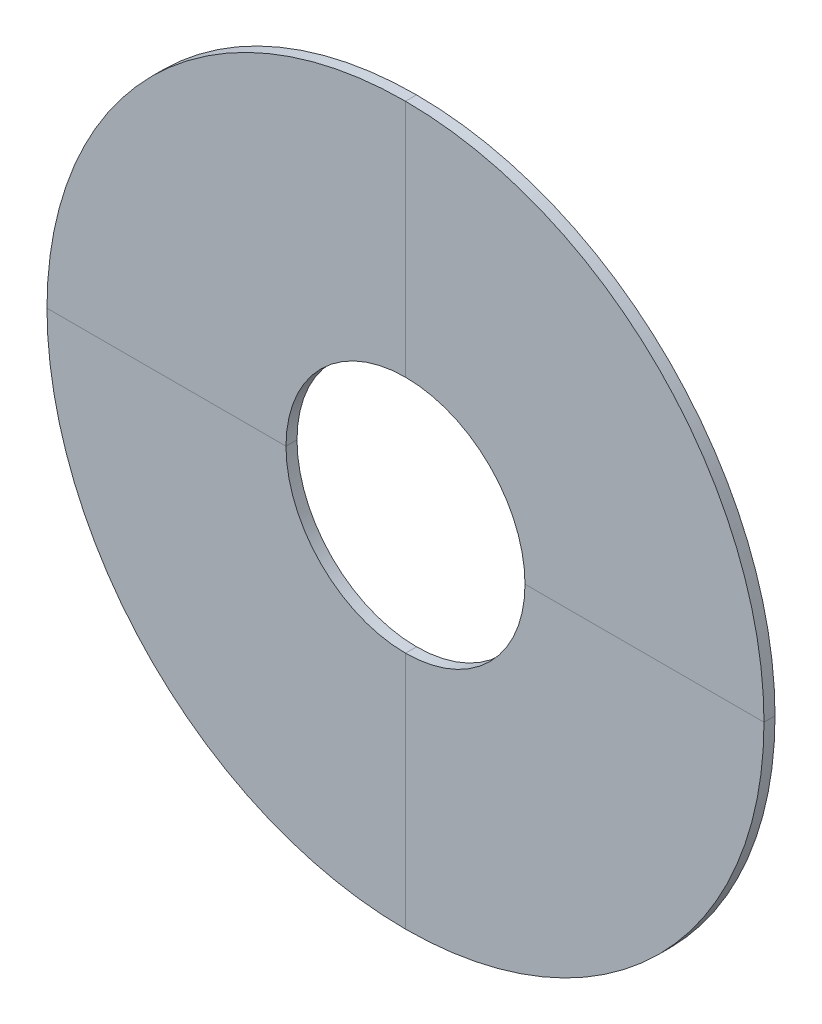
ISO-10303-21;
HEADER;
FILE_DESCRIPTION(('STEP AP214'),'2;1');
FILE_NAME('part.step','',(''),(''),'','','');
FILE_SCHEMA(('AUTOMOTIVE_DESIGN { 1 0 10303 214 1 1 1 1 }'));
ENDSEC;
DATA;
#1=APPLICATION_CONTEXT('core data for automotive mechanical design processes');
#2=APPLICATION_PROTOCOL_DEFINITION('international standard','automotive_design',2000,#1);
#3=PRODUCT_CONTEXT('',#1,'mechanical');
#4=PRODUCT('Part','Part','',(#3));
#5=PRODUCT_RELATED_PRODUCT_CATEGORY('part','',(#4));
#6=PRODUCT_DEFINITION_FORMATION('','',#4);
#7=PRODUCT_DEFINITION_CONTEXT('part definition',#1,'design');
#8=PRODUCT_DEFINITION('design','',#6,#7);
#9=PRODUCT_DEFINITION_SHAPE('','',#8);
#10=(LENGTH_UNIT() NAMED_UNIT(*) SI_UNIT(.MILLI.,.METRE.));
#11=(NAMED_UNIT(*) PLANE_ANGLE_UNIT() SI_UNIT($,.RADIAN.));
#12=(NAMED_UNIT(*) SI_UNIT($,.STERADIAN.) SOLID_ANGLE_UNIT());
#13=UNCERTAINTY_MEASURE_WITH_UNIT(LENGTH_MEASURE(1.E-05),#10,'distance_accuracy_value','');
#14=(GEOMETRIC_REPRESENTATION_CONTEXT(3) GLOBAL_UNCERTAINTY_ASSIGNED_CONTEXT((#13)) GLOBAL_UNIT_ASSIGNED_CONTEXT((#10,
#11,#12)) REPRESENTATION_CONTEXT('',''));
#15=CARTESIAN_POINT('',(0.,0.,0.));
#16=DIRECTION('',(0.,0.,1.));
#17=DIRECTION('',(1.,0.,0.));
#18=AXIS2_PLACEMENT_3D('',#15,#16,#17);
#19=CARTESIAN_POINT('',(0.,0.,0.));
#20=DIRECTION('',(0.,1.,0.));
#21=DIRECTION('',(0.,0.,1.));
#22=AXIS2_PLACEMENT_3D('',#19,#20,#21);
#23=PLANE('',#22);
#24=DIRECTION('',(1.,0.,0.));
#25=VECTOR('',#24,1.);
#26=CARTESIAN_POINT('',(0.,0.,2.99999999999998));
#27=LINE('',#26,#25);
#28=CARTESIAN_POINT('',(-195.,0.,2.99999999999998));
#29=VERTEX_POINT('',#28);
#30=CARTESIAN_POINT('',(-65.,0.,2.99999999999999));
#31=VERTEX_POINT('',#30);
#32=EDGE_CURVE('E105',#29,#31,#27,.T.);
#33=ORIENTED_EDGE('',*,*,#32,.T.);
#34=DIRECTION('',(0.,0.,1.));
#35=VECTOR('',#34,1.);
#36=CARTESIAN_POINT('',(-65.,0.,3.));
#37=LINE('',#36,#35);
#38=CARTESIAN_POINT('',(-65.,0.,-3.00000000000001));
#39=VERTEX_POINT('',#38);
#40=EDGE_CURVE('E109',#31,#39,#37,.F.);
#41=ORIENTED_EDGE('',*,*,#40,.T.);
#42=DIRECTION('',(-1.,0.,0.));
#43=VECTOR('',#42,1.);
#44=CARTESIAN_POINT('',(0.,0.,-3.00000000000003));
#45=LINE('',#44,#43);
#46=CARTESIAN_POINT('',(-195.,0.,-3.00000000000005));
#47=VERTEX_POINT('',#46);
#48=EDGE_CURVE('E95',#39,#47,#45,.T.);
#49=ORIENTED_EDGE('',*,*,#48,.T.);
#50=DIRECTION('',(0.,0.,1.));
#51=VECTOR('',#50,1.);
#52=CARTESIAN_POINT('',(-195.,0.,3.));
#53=LINE('',#52,#51);
#54=EDGE_CURVE('E99',#47,#29,#53,.T.);
#55=ORIENTED_EDGE('',*,*,#54,.T.);
#56=EDGE_LOOP('',(#33,#41,#49,#55));
#57=FACE_BOUND('',#56,.T.);
#58=ADVANCED_FACE('F53',(#57),#23,.T.);
#59=CARTESIAN_POINT('',(0.,0.,3.));
#60=DIRECTION('',(0.,0.,1.));
#61=DIRECTION('',(0.,-1.,0.));
#62=AXIS2_PLACEMENT_3D('',#59,#60,#61);
#63=CYLINDRICAL_SURFACE('',#62,65.);
#64=ORIENTED_EDGE('',*,*,#40,.F.);
#65=CARTESIAN_POINT('',(0.,0.,2.99999999999999));
#66=DIRECTION('',(0.,0.,1.));
#67=DIRECTION('',(0.,-1.,0.));
#68=AXIS2_PLACEMENT_3D('',#65,#66,#67);
#69=CIRCLE('',#68,65.);
#70=CARTESIAN_POINT('',(0.,-65.,2.99999999999998));
#71=VERTEX_POINT('',#70);
#72=EDGE_CURVE('E118',#31,#71,#69,.T.);
#73=ORIENTED_EDGE('',*,*,#72,.T.);
#74=DIRECTION('',(0.,0.,1.));
#75=VECTOR('',#74,1.);
#76=CARTESIAN_POINT('',(0.,-65.,2.99999999999999));
#77=LINE('',#76,#75);
#78=CARTESIAN_POINT('',(0.,-65.,-3.00000000000003));
#79=VERTEX_POINT('',#78);
#80=EDGE_CURVE('E119',#79,#71,#77,.T.);
#81=ORIENTED_EDGE('',*,*,#80,.F.);
#82=CARTESIAN_POINT('',(0.,0.,-3.00000000000001));
#83=DIRECTION('',(0.,0.,1.));
#84=DIRECTION('',(0.,-1.,0.));
#85=AXIS2_PLACEMENT_3D('',#82,#83,#84);
#86=CIRCLE('',#85,65.);
#87=EDGE_CURVE('E77',#39,#79,#86,.T.);
#88=ORIENTED_EDGE('',*,*,#87,.F.);
#89=EDGE_LOOP('',(#64,#73,#81,#88));
#90=FACE_BOUND('',#89,.T.);
#91=ADVANCED_FACE('F138',(#90),#63,.F.);
#92=CARTESIAN_POINT('',(0.,65.,3.));
#93=DIRECTION('',(0.,0.,-1.));
#94=DIRECTION('',(0.,1.,0.));
#95=AXIS2_PLACEMENT_3D('',#92,#93,#94);
#96=PLANE('',#95);
#97=ORIENTED_EDGE('',*,*,#32,.F.);
#98=CARTESIAN_POINT('',(0.,0.,2.99999999999998));
#99=DIRECTION('',(0.,0.,1.));
#100=DIRECTION('',(0.,-1.,0.));
#101=AXIS2_PLACEMENT_3D('',#98,#99,#100);
#102=CIRCLE('',#101,195.);
#103=CARTESIAN_POINT('',(0.,-195.,2.99999999999994));
#104=VERTEX_POINT('',#103);
#105=EDGE_CURVE('E96',#29,#104,#102,.T.);
#106=ORIENTED_EDGE('',*,*,#105,.T.);
#107=DIRECTION('',(0.,-1.,0.));
#108=VECTOR('',#107,1.);
#109=CARTESIAN_POINT('',(0.,65.,3.));
#110=LINE('',#109,#108);
#111=EDGE_CURVE('E120',#71,#104,#110,.T.);
#112=ORIENTED_EDGE('',*,*,#111,.F.);
#113=ORIENTED_EDGE('',*,*,#72,.F.);
#114=EDGE_LOOP('',(#97,#106,#112,#113));
#115=FACE_BOUND('',#114,.T.);
#116=ADVANCED_FACE('F136',(#115),#96,.F.);
#117=CARTESIAN_POINT('',(0.,0.,3.));
#118=DIRECTION('',(0.,0.,1.));
#119=DIRECTION('',(0.,-1.,0.));
#120=AXIS2_PLACEMENT_3D('',#117,#118,#119);
#121=CYLINDRICAL_SURFACE('',#120,195.);
#122=ORIENTED_EDGE('',*,*,#54,.F.);
#123=CARTESIAN_POINT('',(0.,0.,-3.00000000000005));
#124=DIRECTION('',(0.,0.,1.));
#125=DIRECTION('',(0.,-1.,0.));
#126=AXIS2_PLACEMENT_3D('',#123,#124,#125);
#127=CIRCLE('',#126,195.);
#128=CARTESIAN_POINT('',(0.,-195.,-3.00000000000009));
#129=VERTEX_POINT('',#128);
#130=EDGE_CURVE('E69',#47,#129,#127,.T.);
#131=ORIENTED_EDGE('',*,*,#130,.T.);
#132=DIRECTION('',(0.,0.,1.));
#133=VECTOR('',#132,1.);
#134=CARTESIAN_POINT('',(0.,-195.,2.99999999999996));
#135=LINE('',#134,#133);
#136=EDGE_CURVE('E62',#104,#129,#135,.F.);
#137=ORIENTED_EDGE('',*,*,#136,.F.);
#138=ORIENTED_EDGE('',*,*,#105,.F.);
#139=EDGE_LOOP('',(#122,#131,#137,#138));
#140=FACE_BOUND('',#139,.T.);
#141=ADVANCED_FACE('F100',(#140),#121,.T.);
#142=CARTESIAN_POINT('',(0.,195.,-3.));
#143=DIRECTION('',(0.,0.,1.));
#144=DIRECTION('',(0.,-1.,0.));
#145=AXIS2_PLACEMENT_3D('',#142,#143,#144);
#146=PLANE('',#145);
#147=ORIENTED_EDGE('',*,*,#48,.F.);
#148=ORIENTED_EDGE('',*,*,#87,.T.);
#149=DIRECTION('',(0.,1.,0.));
#150=VECTOR('',#149,1.);
#151=CARTESIAN_POINT('',(0.,195.,-3.));
#152=LINE('',#151,#150);
#153=EDGE_CURVE('E12',#129,#79,#152,.T.);
#154=ORIENTED_EDGE('',*,*,#153,.F.);
#155=ORIENTED_EDGE('',*,*,#130,.F.);
#156=EDGE_LOOP('',(#147,#148,#154,#155));
#157=FACE_BOUND('',#156,.T.);
#158=ADVANCED_FACE('F55',(#157),#146,.F.);
#159=CARTESIAN_POINT('',(0.,0.,0.));
#160=DIRECTION('',(1.,0.,0.));
#161=DIRECTION('',(0.,0.,-1.));
#162=AXIS2_PLACEMENT_3D('',#159,#160,#161);
#163=PLANE('',#162);
#164=ORIENTED_EDGE('',*,*,#153,.T.);
#165=ORIENTED_EDGE('',*,*,#80,.T.);
#166=ORIENTED_EDGE('',*,*,#111,.T.);
#167=ORIENTED_EDGE('',*,*,#136,.T.);
#168=EDGE_LOOP('',(#164,#165,#166,#167));
#169=FACE_BOUND('',#168,.T.);
#170=ADVANCED_FACE('F139',(#169),#163,.T.);
#171=CLOSED_SHELL('',(#58,#91,#116,#141,#158,#170));
#172=MANIFOLD_SOLID_BREP('B2',#171);
#173=CARTESIAN_POINT('',(0.,0.,0.));
#174=DIRECTION('',(0.,1.,0.));
#175=DIRECTION('',(0.,0.,1.));
#176=AXIS2_PLACEMENT_3D('',#173,#174,#175);
#177=PLANE('',#176);
#178=DIRECTION('',(1.,0.,0.));
#179=VECTOR('',#178,1.);
#180=CARTESIAN_POINT('',(0.,0.,2.99999999999998));
#181=LINE('',#180,#179);
#182=CARTESIAN_POINT('',(-195.,0.,2.99999999999998));
#183=VERTEX_POINT('',#182);
#184=CARTESIAN_POINT('',(-65.,0.,2.99999999999999));
#185=VERTEX_POINT('',#184);
#186=EDGE_CURVE('E219',#183,#185,#181,.T.);
#187=ORIENTED_EDGE('',*,*,#186,.F.);
#188=DIRECTION('',(0.,0.,1.));
#189=VECTOR('',#188,1.);
#190=CARTESIAN_POINT('',(-195.,0.,3.));
#191=LINE('',#190,#189);
#192=CARTESIAN_POINT('',(-195.,0.,-3.00000000000005));
#193=VERTEX_POINT('',#192);
#194=EDGE_CURVE('E232',#193,#183,#191,.T.);
#195=ORIENTED_EDGE('',*,*,#194,.F.);
#196=DIRECTION('',(-1.,0.,0.));
#197=VECTOR('',#196,1.);
#198=CARTESIAN_POINT('',(0.,0.,-3.00000000000003));
#199=LINE('',#198,#197);
#200=CARTESIAN_POINT('',(-65.,0.,-3.00000000000001));
#201=VERTEX_POINT('',#200);
#202=EDGE_CURVE('E256',#201,#193,#199,.T.);
#203=ORIENTED_EDGE('',*,*,#202,.F.);
#204=DIRECTION('',(0.,0.,1.));
#205=VECTOR('',#204,1.);
#206=CARTESIAN_POINT('',(-65.,0.,3.));
#207=LINE('',#206,#205);
#208=EDGE_CURVE('E51',#185,#201,#207,.F.);
#209=ORIENTED_EDGE('',*,*,#208,.F.);
#210=EDGE_LOOP('',(#187,#195,#203,#209));
#211=FACE_BOUND('',#210,.T.);
#212=ADVANCED_FACE('F212',(#211),#177,.F.);
#213=CARTESIAN_POINT('',(0.,65.,3.));
#214=DIRECTION('',(0.,0.,-1.));
#215=DIRECTION('',(0.,1.,0.));
#216=AXIS2_PLACEMENT_3D('',#213,#214,#215);
#217=PLANE('',#216);
#218=CARTESIAN_POINT('',(0.,0.,2.99999999999998));
#219=DIRECTION('',(0.,0.,1.));
#220=DIRECTION('',(0.,-1.,0.));
#221=AXIS2_PLACEMENT_3D('',#218,#219,#220);
#222=CIRCLE('',#221,195.);
#223=CARTESIAN_POINT('',(0.,195.,3.00000000000002));
#224=VERTEX_POINT('',#223);
#225=EDGE_CURVE('E258',#224,#183,#222,.T.);
#226=ORIENTED_EDGE('',*,*,#225,.T.);
#227=ORIENTED_EDGE('',*,*,#186,.T.);
#228=CARTESIAN_POINT('',(0.,0.,2.99999999999999));
#229=DIRECTION('',(0.,0.,1.));
#230=DIRECTION('',(0.,-1.,0.));
#231=AXIS2_PLACEMENT_3D('',#228,#229,#230);
#232=CIRCLE('',#231,65.);
#233=CARTESIAN_POINT('',(0.,65.,3.));
#234=VERTEX_POINT('',#233);
#235=EDGE_CURVE('E281',#234,#185,#232,.T.);
#236=ORIENTED_EDGE('',*,*,#235,.F.);
#237=DIRECTION('',(0.,-1.,0.));
#238=VECTOR('',#237,1.);
#239=CARTESIAN_POINT('',(0.,65.,3.));
#240=LINE('',#239,#238);
#241=EDGE_CURVE('E268',#224,#234,#240,.T.);
#242=ORIENTED_EDGE('',*,*,#241,.F.);
#243=EDGE_LOOP('',(#226,#227,#236,#242));
#244=FACE_BOUND('',#243,.T.);
#245=ADVANCED_FACE('F293',(#244),#217,.F.);
#246=CARTESIAN_POINT('',(0.,0.,0.));
#247=DIRECTION('',(1.,0.,0.));
#248=DIRECTION('',(0.,0.,-1.));
#249=AXIS2_PLACEMENT_3D('',#246,#247,#248);
#250=PLANE('',#249);
#251=ORIENTED_EDGE('',*,*,#241,.T.);
#252=DIRECTION('',(0.,0.,1.));
#253=VECTOR('',#252,1.);
#254=CARTESIAN_POINT('',(0.,65.,3.00000000000001));
#255=LINE('',#254,#253);
#256=CARTESIAN_POINT('',(0.,65.,-3.));
#257=VERTEX_POINT('',#256);
#258=EDGE_CURVE('E273',#234,#257,#255,.F.);
#259=ORIENTED_EDGE('',*,*,#258,.T.);
#260=DIRECTION('',(0.,1.,0.));
#261=VECTOR('',#260,1.);
#262=CARTESIAN_POINT('',(0.,195.,-3.));
#263=LINE('',#262,#261);
#264=CARTESIAN_POINT('',(0.,195.,-3.00000000000002));
#265=VERTEX_POINT('',#264);
#266=EDGE_CURVE('E255',#257,#265,#263,.T.);
#267=ORIENTED_EDGE('',*,*,#266,.T.);
#268=DIRECTION('',(0.,0.,1.));
#269=VECTOR('',#268,1.);
#270=CARTESIAN_POINT('',(0.,195.,3.00000000000004));
#271=LINE('',#270,#269);
#272=EDGE_CURVE('E261',#265,#224,#271,.T.);
#273=ORIENTED_EDGE('',*,*,#272,.T.);
#274=EDGE_LOOP('',(#251,#259,#267,#273));
#275=FACE_BOUND('',#274,.T.);
#276=ADVANCED_FACE('F271',(#275),#250,.T.);
#277=CARTESIAN_POINT('',(0.,0.,3.));
#278=DIRECTION('',(0.,0.,1.));
#279=DIRECTION('',(0.,-1.,0.));
#280=AXIS2_PLACEMENT_3D('',#277,#278,#279);
#281=CYLINDRICAL_SURFACE('',#280,195.);
#282=CARTESIAN_POINT('',(0.,0.,-3.00000000000005));
#283=DIRECTION('',(0.,0.,1.));
#284=DIRECTION('',(0.,-1.,0.));
#285=AXIS2_PLACEMENT_3D('',#282,#283,#284);
#286=CIRCLE('',#285,195.);
#287=EDGE_CURVE('E250',#265,#193,#286,.T.);
#288=ORIENTED_EDGE('',*,*,#287,.T.);
#289=ORIENTED_EDGE('',*,*,#194,.T.);
#290=ORIENTED_EDGE('',*,*,#225,.F.);
#291=ORIENTED_EDGE('',*,*,#272,.F.);
#292=EDGE_LOOP('',(#288,#289,#290,#291));
#293=FACE_BOUND('',#292,.T.);
#294=ADVANCED_FACE('F262',(#293),#281,.T.);
#295=CARTESIAN_POINT('',(0.,0.,3.));
#296=DIRECTION('',(0.,0.,1.));
#297=DIRECTION('',(0.,-1.,0.));
#298=AXIS2_PLACEMENT_3D('',#295,#296,#297);
#299=CYLINDRICAL_SURFACE('',#298,65.);
#300=ORIENTED_EDGE('',*,*,#235,.T.);
#301=ORIENTED_EDGE('',*,*,#208,.T.);
#302=CARTESIAN_POINT('',(0.,0.,-3.00000000000001));
#303=DIRECTION('',(0.,0.,1.));
#304=DIRECTION('',(0.,-1.,0.));
#305=AXIS2_PLACEMENT_3D('',#302,#303,#304);
#306=CIRCLE('',#305,65.);
#307=EDGE_CURVE('E257',#257,#201,#306,.T.);
#308=ORIENTED_EDGE('',*,*,#307,.F.);
#309=ORIENTED_EDGE('',*,*,#258,.F.);
#310=EDGE_LOOP('',(#300,#301,#308,#309));
#311=FACE_BOUND('',#310,.T.);
#312=ADVANCED_FACE('F295',(#311),#299,.F.);
#313=CARTESIAN_POINT('',(0.,195.,-3.));
#314=DIRECTION('',(0.,0.,1.));
#315=DIRECTION('',(0.,-1.,0.));
#316=AXIS2_PLACEMENT_3D('',#313,#314,#315);
#317=PLANE('',#316);
#318=ORIENTED_EDGE('',*,*,#307,.T.);
#319=ORIENTED_EDGE('',*,*,#202,.T.);
#320=ORIENTED_EDGE('',*,*,#287,.F.);
#321=ORIENTED_EDGE('',*,*,#266,.F.);
#322=EDGE_LOOP('',(#318,#319,#320,#321));
#323=FACE_BOUND('',#322,.T.);
#324=ADVANCED_FACE('F253',(#323),#317,.F.);
#325=CLOSED_SHELL('',(#212,#245,#276,#294,#312,#324));
#326=MANIFOLD_SOLID_BREP('B6',#325);
#327=CARTESIAN_POINT('',(0.,0.,0.));
#328=DIRECTION('',(0.,1.,0.));
#329=DIRECTION('',(0.,0.,1.));
#330=AXIS2_PLACEMENT_3D('',#327,#328,#329);
#331=PLANE('',#330);
#332=DIRECTION('',(-1.,0.,0.));
#333=VECTOR('',#332,1.);
#334=CARTESIAN_POINT('',(0.,0.,-3.00000000000003));
#335=LINE('',#334,#333);
#336=CARTESIAN_POINT('',(195.,0.,-3.00000000000005));
#337=VERTEX_POINT('',#336);
#338=CARTESIAN_POINT('',(65.,0.,-3.00000000000001));
#339=VERTEX_POINT('',#338);
#340=EDGE_CURVE('E421',#337,#339,#335,.T.);
#341=ORIENTED_EDGE('',*,*,#340,.T.);
#342=DIRECTION('',(0.,0.,1.));
#343=VECTOR('',#342,1.);
#344=CARTESIAN_POINT('',(65.,0.,3.));
#345=LINE('',#344,#343);
#346=CARTESIAN_POINT('',(65.,0.,2.99999999999999));
#347=VERTEX_POINT('',#346);
#348=EDGE_CURVE('E425',#339,#347,#345,.T.);
#349=ORIENTED_EDGE('',*,*,#348,.T.);
#350=DIRECTION('',(1.,0.,0.));
#351=VECTOR('',#350,1.);
#352=CARTESIAN_POINT('',(0.,0.,2.99999999999998));
#353=LINE('',#352,#351);
#354=CARTESIAN_POINT('',(195.,0.,2.99999999999998));
#355=VERTEX_POINT('',#354);
#356=EDGE_CURVE('E423',#347,#355,#353,.T.);
#357=ORIENTED_EDGE('',*,*,#356,.T.);
#358=DIRECTION('',(0.,0.,1.));
#359=VECTOR('',#358,1.);
#360=CARTESIAN_POINT('',(195.,0.,3.));
#361=LINE('',#360,#359);
#362=EDGE_CURVE('E413',#355,#337,#361,.F.);
#363=ORIENTED_EDGE('',*,*,#362,.T.);
#364=EDGE_LOOP('',(#341,#349,#357,#363));
#365=FACE_BOUND('',#364,.T.);
#366=ADVANCED_FACE('F371',(#365),#331,.T.);
#367=CARTESIAN_POINT('',(0.,65.,3.));
#368=DIRECTION('',(0.,0.,-1.));
#369=DIRECTION('',(0.,1.,0.));
#370=AXIS2_PLACEMENT_3D('',#367,#368,#369);
#371=PLANE('',#370);
#372=ORIENTED_EDGE('',*,*,#356,.F.);
#373=CARTESIAN_POINT('',(0.,0.,2.99999999999999));
#374=DIRECTION('',(0.,0.,1.));
#375=DIRECTION('',(0.,-1.,0.));
#376=AXIS2_PLACEMENT_3D('',#373,#374,#375);
#377=CIRCLE('',#376,65.);
#378=CARTESIAN_POINT('',(0.,-65.,2.99999999999998));
#379=VERTEX_POINT('',#378);
#380=EDGE_CURVE('E441',#379,#347,#377,.T.);
#381=ORIENTED_EDGE('',*,*,#380,.F.);
#382=DIRECTION('',(0.,-1.,0.));
#383=VECTOR('',#382,1.);
#384=CARTESIAN_POINT('',(0.,65.,3.));
#385=LINE('',#384,#383);
#386=CARTESIAN_POINT('',(0.,-195.,2.99999999999994));
#387=VERTEX_POINT('',#386);
#388=EDGE_CURVE('E435',#379,#387,#385,.T.);
#389=ORIENTED_EDGE('',*,*,#388,.T.);
#390=CARTESIAN_POINT('',(0.,0.,2.99999999999998));
#391=DIRECTION('',(0.,0.,1.));
#392=DIRECTION('',(0.,-1.,0.));
#393=AXIS2_PLACEMENT_3D('',#390,#391,#392);
#394=CIRCLE('',#393,195.);
#395=EDGE_CURVE('E416',#387,#355,#394,.T.);
#396=ORIENTED_EDGE('',*,*,#395,.T.);
#397=EDGE_LOOP('',(#372,#381,#389,#396));
#398=FACE_BOUND('',#397,.T.);
#399=ADVANCED_FACE('F444',(#398),#371,.F.);
#400=CARTESIAN_POINT('',(0.,0.,3.));
#401=DIRECTION('',(0.,0.,1.));
#402=DIRECTION('',(0.,-1.,0.));
#403=AXIS2_PLACEMENT_3D('',#400,#401,#402);
#404=CYLINDRICAL_SURFACE('',#403,65.);
#405=ORIENTED_EDGE('',*,*,#348,.F.);
#406=CARTESIAN_POINT('',(0.,0.,-3.00000000000001));
#407=DIRECTION('',(0.,0.,1.));
#408=DIRECTION('',(0.,-1.,0.));
#409=AXIS2_PLACEMENT_3D('',#406,#407,#408);
#410=CIRCLE('',#409,65.);
#411=CARTESIAN_POINT('',(0.,-65.,-3.00000000000003));
#412=VERTEX_POINT('',#411);
#413=EDGE_CURVE('E210',#412,#339,#410,.T.);
#414=ORIENTED_EDGE('',*,*,#413,.F.);
#415=DIRECTION('',(0.,0.,1.));
#416=VECTOR('',#415,1.);
#417=CARTESIAN_POINT('',(0.,-65.,2.99999999999999));
#418=LINE('',#417,#416);
#419=EDGE_CURVE('E393',#412,#379,#418,.T.);
#420=ORIENTED_EDGE('',*,*,#419,.T.);
#421=ORIENTED_EDGE('',*,*,#380,.T.);
#422=EDGE_LOOP('',(#405,#414,#420,#421));
#423=FACE_BOUND('',#422,.T.);
#424=ADVANCED_FACE('F455',(#423),#404,.F.);
#425=CARTESIAN_POINT('',(0.,0.,3.));
#426=DIRECTION('',(0.,0.,1.));
#427=DIRECTION('',(0.,-1.,0.));
#428=AXIS2_PLACEMENT_3D('',#425,#426,#427);
#429=CYLINDRICAL_SURFACE('',#428,195.);
#430=ORIENTED_EDGE('',*,*,#362,.F.);
#431=ORIENTED_EDGE('',*,*,#395,.F.);
#432=DIRECTION('',(0.,0.,1.));
#433=VECTOR('',#432,1.);
#434=CARTESIAN_POINT('',(0.,-195.,2.99999999999996));
#435=LINE('',#434,#433);
#436=CARTESIAN_POINT('',(0.,-195.,-3.00000000000009));
#437=VERTEX_POINT('',#436);
#438=EDGE_CURVE('E386',#387,#437,#435,.F.);
#439=ORIENTED_EDGE('',*,*,#438,.T.);
#440=CARTESIAN_POINT('',(0.,0.,-3.00000000000005));
#441=DIRECTION('',(0.,0.,1.));
#442=DIRECTION('',(0.,-1.,0.));
#443=AXIS2_PLACEMENT_3D('',#440,#441,#442);
#444=CIRCLE('',#443,195.);
#445=EDGE_CURVE('E379',#437,#337,#444,.T.);
#446=ORIENTED_EDGE('',*,*,#445,.T.);
#447=EDGE_LOOP('',(#430,#431,#439,#446));
#448=FACE_BOUND('',#447,.T.);
#449=ADVANCED_FACE('F412',(#448),#429,.T.);
#450=CARTESIAN_POINT('',(0.,195.,-3.));
#451=DIRECTION('',(0.,0.,1.));
#452=DIRECTION('',(0.,-1.,0.));
#453=AXIS2_PLACEMENT_3D('',#450,#451,#452);
#454=PLANE('',#453);
#455=ORIENTED_EDGE('',*,*,#340,.F.);
#456=ORIENTED_EDGE('',*,*,#445,.F.);
#457=DIRECTION('',(0.,1.,0.));
#458=VECTOR('',#457,1.);
#459=CARTESIAN_POINT('',(0.,195.,-3.));
#460=LINE('',#459,#458);
#461=EDGE_CURVE('E438',#437,#412,#460,.T.);
#462=ORIENTED_EDGE('',*,*,#461,.T.);
#463=ORIENTED_EDGE('',*,*,#413,.T.);
#464=EDGE_LOOP('',(#455,#456,#462,#463));
#465=FACE_BOUND('',#464,.T.);
#466=ADVANCED_FACE('F373',(#465),#454,.F.);
#467=CARTESIAN_POINT('',(0.,0.,0.));
#468=DIRECTION('',(1.,0.,0.));
#469=DIRECTION('',(0.,0.,-1.));
#470=AXIS2_PLACEMENT_3D('',#467,#468,#469);
#471=PLANE('',#470);
#472=ORIENTED_EDGE('',*,*,#461,.F.);
#473=ORIENTED_EDGE('',*,*,#438,.F.);
#474=ORIENTED_EDGE('',*,*,#388,.F.);
#475=ORIENTED_EDGE('',*,*,#419,.F.);
#476=EDGE_LOOP('',(#472,#473,#474,#475));
#477=FACE_BOUND('',#476,.T.);
#478=ADVANCED_FACE('F446',(#477),#471,.F.);
#479=CLOSED_SHELL('',(#366,#399,#424,#449,#466,#478));
#480=MANIFOLD_SOLID_BREP('B45',#479);
#481=CARTESIAN_POINT('',(0.,0.,0.));
#482=DIRECTION('',(0.,1.,0.));
#483=DIRECTION('',(0.,0.,1.));
#484=AXIS2_PLACEMENT_3D('',#481,#482,#483);
#485=PLANE('',#484);
#486=DIRECTION('',(-1.,0.,0.));
#487=VECTOR('',#486,1.);
#488=CARTESIAN_POINT('',(0.,0.,-3.00000000000003));
#489=LINE('',#488,#487);
#490=CARTESIAN_POINT('',(195.,0.,-3.00000000000005));
#491=VERTEX_POINT('',#490);
#492=CARTESIAN_POINT('',(65.,0.,-3.00000000000001));
#493=VERTEX_POINT('',#492);
#494=EDGE_CURVE('E604',#491,#493,#489,.T.);
#495=ORIENTED_EDGE('',*,*,#494,.F.);
#496=DIRECTION('',(0.,0.,1.));
#497=VECTOR('',#496,1.);
#498=CARTESIAN_POINT('',(195.,0.,3.));
#499=LINE('',#498,#497);
#500=CARTESIAN_POINT('',(195.,0.,2.99999999999998));
#501=VERTEX_POINT('',#500);
#502=EDGE_CURVE('E575',#501,#491,#499,.F.);
#503=ORIENTED_EDGE('',*,*,#502,.F.);
#504=DIRECTION('',(1.,0.,0.));
#505=VECTOR('',#504,1.);
#506=CARTESIAN_POINT('',(0.,0.,2.99999999999998));
#507=LINE('',#506,#505);
#508=CARTESIAN_POINT('',(65.,0.,2.99999999999999));
#509=VERTEX_POINT('',#508);
#510=EDGE_CURVE('E369',#509,#501,#507,.T.);
#511=ORIENTED_EDGE('',*,*,#510,.F.);
#512=DIRECTION('',(0.,0.,1.));
#513=VECTOR('',#512,1.);
#514=CARTESIAN_POINT('',(65.,0.,3.));
#515=LINE('',#514,#513);
#516=EDGE_CURVE('E533',#493,#509,#515,.T.);
#517=ORIENTED_EDGE('',*,*,#516,.F.);
#518=EDGE_LOOP('',(#495,#503,#511,#517));
#519=FACE_BOUND('',#518,.T.);
#520=ADVANCED_FACE('F530',(#519),#485,.F.);
#521=CARTESIAN_POINT('',(0.,65.,3.));
#522=DIRECTION('',(0.,0.,-1.));
#523=DIRECTION('',(0.,1.,0.));
#524=AXIS2_PLACEMENT_3D('',#521,#522,#523);
#525=PLANE('',#524);
#526=CARTESIAN_POINT('',(0.,0.,2.99999999999999));
#527=DIRECTION('',(0.,0.,1.));
#528=DIRECTION('',(0.,-1.,0.));
#529=AXIS2_PLACEMENT_3D('',#526,#527,#528);
#530=CIRCLE('',#529,65.);
#531=CARTESIAN_POINT('',(0.,65.,3.));
#532=VERTEX_POINT('',#531);
#533=EDGE_CURVE('E589',#509,#532,#530,.T.);
#534=ORIENTED_EDGE('',*,*,#533,.F.);
#535=ORIENTED_EDGE('',*,*,#510,.T.);
#536=CARTESIAN_POINT('',(0.,0.,2.99999999999998));
#537=DIRECTION('',(0.,0.,1.));
#538=DIRECTION('',(0.,-1.,0.));
#539=AXIS2_PLACEMENT_3D('',#536,#537,#538);
#540=CIRCLE('',#539,195.);
#541=CARTESIAN_POINT('',(0.,195.,3.00000000000002));
#542=VERTEX_POINT('',#541);
#543=EDGE_CURVE('E579',#501,#542,#540,.T.);
#544=ORIENTED_EDGE('',*,*,#543,.T.);
#545=DIRECTION('',(0.,-1.,0.));
#546=VECTOR('',#545,1.);
#547=CARTESIAN_POINT('',(0.,65.,3.));
#548=LINE('',#547,#546);
#549=EDGE_CURVE('E593',#542,#532,#548,.T.);
#550=ORIENTED_EDGE('',*,*,#549,.T.);
#551=EDGE_LOOP('',(#534,#535,#544,#550));
#552=FACE_BOUND('',#551,.T.);
#553=ADVANCED_FACE('F620',(#552),#525,.F.);
#554=CARTESIAN_POINT('',(0.,0.,0.));
#555=DIRECTION('',(1.,0.,0.));
#556=DIRECTION('',(0.,0.,-1.));
#557=AXIS2_PLACEMENT_3D('',#554,#555,#556);
#558=PLANE('',#557);
#559=ORIENTED_EDGE('',*,*,#549,.F.);
#560=DIRECTION('',(0.,0.,1.));
#561=VECTOR('',#560,1.);
#562=CARTESIAN_POINT('',(0.,195.,3.00000000000004));
#563=LINE('',#562,#561);
#564=CARTESIAN_POINT('',(0.,195.,-3.00000000000002));
#565=VERTEX_POINT('',#564);
#566=EDGE_CURVE('E573',#565,#542,#563,.T.);
#567=ORIENTED_EDGE('',*,*,#566,.F.);
#568=DIRECTION('',(0.,1.,0.));
#569=VECTOR('',#568,1.);
#570=CARTESIAN_POINT('',(0.,195.,-3.));
#571=LINE('',#570,#569);
#572=CARTESIAN_POINT('',(0.,65.,-3.));
#573=VERTEX_POINT('',#572);
#574=EDGE_CURVE('E583',#573,#565,#571,.T.);
#575=ORIENTED_EDGE('',*,*,#574,.F.);
#576=DIRECTION('',(0.,0.,1.));
#577=VECTOR('',#576,1.);
#578=CARTESIAN_POINT('',(0.,65.,3.00000000000001));
#579=LINE('',#578,#577);
#580=EDGE_CURVE('E599',#532,#573,#579,.F.);
#581=ORIENTED_EDGE('',*,*,#580,.F.);
#582=EDGE_LOOP('',(#559,#567,#575,#581));
#583=FACE_BOUND('',#582,.T.);
#584=ADVANCED_FACE('F591',(#583),#558,.F.);
#585=CARTESIAN_POINT('',(0.,0.,3.));
#586=DIRECTION('',(0.,0.,1.));
#587=DIRECTION('',(0.,-1.,0.));
#588=AXIS2_PLACEMENT_3D('',#585,#586,#587);
#589=CYLINDRICAL_SURFACE('',#588,65.);
#590=CARTESIAN_POINT('',(0.,0.,-3.00000000000001));
#591=DIRECTION('',(0.,0.,1.));
#592=DIRECTION('',(0.,-1.,0.));
#593=AXIS2_PLACEMENT_3D('',#590,#591,#592);
#594=CIRCLE('',#593,65.);
#595=EDGE_CURVE('E580',#493,#573,#594,.T.);
#596=ORIENTED_EDGE('',*,*,#595,.F.);
#597=ORIENTED_EDGE('',*,*,#516,.T.);
#598=ORIENTED_EDGE('',*,*,#533,.T.);
#599=ORIENTED_EDGE('',*,*,#580,.T.);
#600=EDGE_LOOP('',(#596,#597,#598,#599));
#601=FACE_BOUND('',#600,.T.);
#602=ADVANCED_FACE('F617',(#601),#589,.F.);
#603=CARTESIAN_POINT('',(0.,0.,3.));
#604=DIRECTION('',(0.,0.,1.));
#605=DIRECTION('',(0.,-1.,0.));
#606=AXIS2_PLACEMENT_3D('',#603,#604,#605);
#607=CYLINDRICAL_SURFACE('',#606,195.);
#608=ORIENTED_EDGE('',*,*,#543,.F.);
#609=ORIENTED_EDGE('',*,*,#502,.T.);
#610=CARTESIAN_POINT('',(0.,0.,-3.00000000000005));
#611=DIRECTION('',(0.,0.,1.));
#612=DIRECTION('',(0.,-1.,0.));
#613=AXIS2_PLACEMENT_3D('',#610,#611,#612);
#614=CIRCLE('',#613,195.);
#615=EDGE_CURVE('E568',#491,#565,#614,.T.);
#616=ORIENTED_EDGE('',*,*,#615,.T.);
#617=ORIENTED_EDGE('',*,*,#566,.T.);
#618=EDGE_LOOP('',(#608,#609,#616,#617));
#619=FACE_BOUND('',#618,.T.);
#620=ADVANCED_FACE('F571',(#619),#607,.T.);
#621=CARTESIAN_POINT('',(0.,195.,-3.));
#622=DIRECTION('',(0.,0.,1.));
#623=DIRECTION('',(0.,-1.,0.));
#624=AXIS2_PLACEMENT_3D('',#621,#622,#623);
#625=PLANE('',#624);
#626=ORIENTED_EDGE('',*,*,#615,.F.);
#627=ORIENTED_EDGE('',*,*,#494,.T.);
#628=ORIENTED_EDGE('',*,*,#595,.T.);
#629=ORIENTED_EDGE('',*,*,#574,.T.);
#630=EDGE_LOOP('',(#626,#627,#628,#629));
#631=FACE_BOUND('',#630,.T.);
#632=ADVANCED_FACE('F584',(#631),#625,.F.);
#633=CLOSED_SHELL('',(#520,#553,#584,#602,#620,#632));
#634=MANIFOLD_SOLID_BREP('B204',#633);
#635=ADVANCED_BREP_SHAPE_REPRESENTATION('',(#18,#172,#326,#480,#634),#14);
#636=SHAPE_DEFINITION_REPRESENTATION(#9,#635);
ENDSEC;
END-ISO-10303-21;
